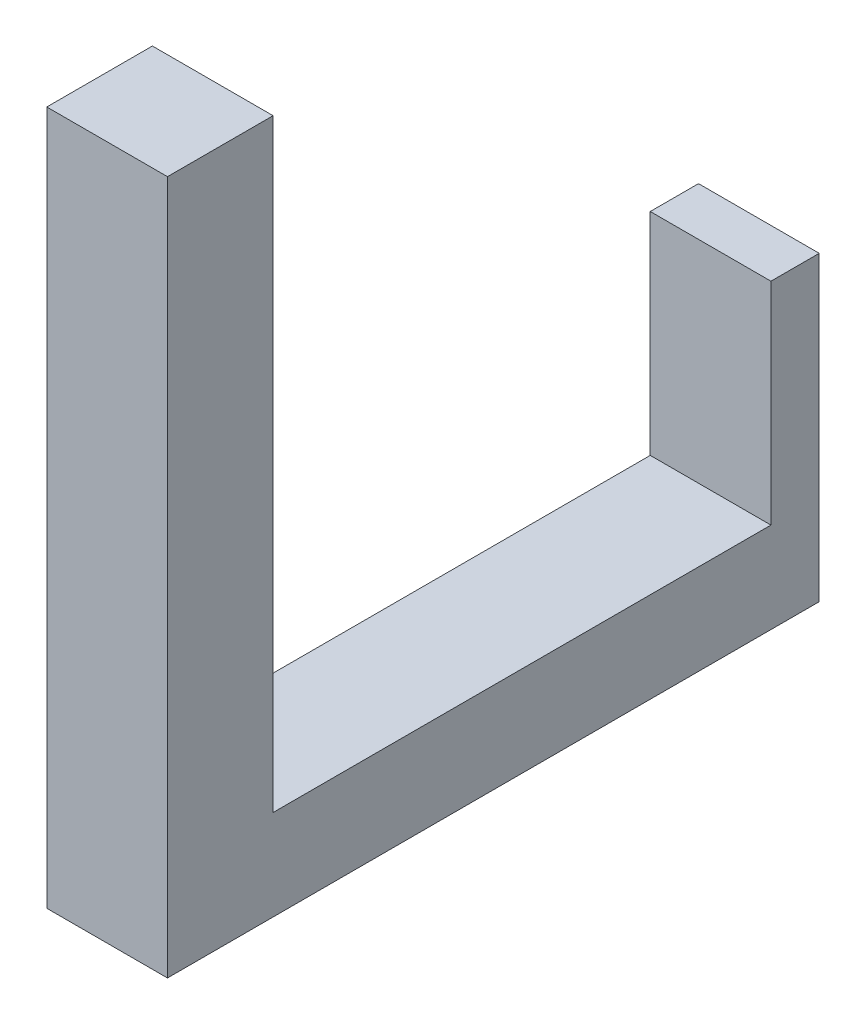
ISO-10303-21;
HEADER;
FILE_DESCRIPTION(('STEP AP214'),'2;1');
FILE_NAME('part.step','',(''),(''),'','','');
FILE_SCHEMA(('AUTOMOTIVE_DESIGN { 1 0 10303 214 1 1 1 1 }'));
ENDSEC;
DATA;
#1=APPLICATION_CONTEXT('core data for automotive mechanical design processes');
#2=APPLICATION_PROTOCOL_DEFINITION('international standard','automotive_design',2000,#1);
#3=PRODUCT_CONTEXT('',#1,'mechanical');
#4=PRODUCT('Part','Part','',(#3));
#5=PRODUCT_RELATED_PRODUCT_CATEGORY('part','',(#4));
#6=PRODUCT_DEFINITION_FORMATION('','',#4);
#7=PRODUCT_DEFINITION_CONTEXT('part definition',#1,'design');
#8=PRODUCT_DEFINITION('design','',#6,#7);
#9=PRODUCT_DEFINITION_SHAPE('','',#8);
#10=(LENGTH_UNIT() NAMED_UNIT(*) SI_UNIT(.MILLI.,.METRE.));
#11=(NAMED_UNIT(*) PLANE_ANGLE_UNIT() SI_UNIT($,.RADIAN.));
#12=(NAMED_UNIT(*) SI_UNIT($,.STERADIAN.) SOLID_ANGLE_UNIT());
#13=UNCERTAINTY_MEASURE_WITH_UNIT(LENGTH_MEASURE(1.E-05),#10,'distance_accuracy_value','');
#14=(GEOMETRIC_REPRESENTATION_CONTEXT(3) GLOBAL_UNCERTAINTY_ASSIGNED_CONTEXT((#13)) GLOBAL_UNIT_ASSIGNED_CONTEXT((#10,
#11,#12)) REPRESENTATION_CONTEXT('',''));
#15=CARTESIAN_POINT('',(0.,0.,0.));
#16=DIRECTION('',(0.,0.,1.));
#17=DIRECTION('',(1.,0.,0.));
#18=AXIS2_PLACEMENT_3D('',#15,#16,#17);
#19=CARTESIAN_POINT('',(-20.,30.,208.));
#20=DIRECTION('',(0.,1.,0.));
#21=DIRECTION('',(0.,0.,1.));
#22=AXIS2_PLACEMENT_3D('',#19,#20,#21);
#23=PLANE('',#22);
#24=DIRECTION('',(0.,0.,-1.));
#25=VECTOR('',#24,1.);
#26=CARTESIAN_POINT('',(-20.,30.,208.));
#27=LINE('',#26,#25);
#28=CARTESIAN_POINT('',(-20.,30.,173.));
#29=VERTEX_POINT('',#28);
#30=CARTESIAN_POINT('',(-20.,30.,8.));
#31=VERTEX_POINT('',#30);
#32=EDGE_CURVE('E60',#29,#31,#27,.T.);
#33=ORIENTED_EDGE('',*,*,#32,.F.);
#34=DIRECTION('',(-1.,0.,0.));
#35=VECTOR('',#34,1.);
#36=CARTESIAN_POINT('',(-20.,30.,173.));
#37=LINE('',#36,#35);
#38=CARTESIAN_POINT('',(20.,30.,173.));
#39=VERTEX_POINT('',#38);
#40=EDGE_CURVE('E55',#39,#29,#37,.T.);
#41=ORIENTED_EDGE('',*,*,#40,.F.);
#42=DIRECTION('',(0.,0.,-1.));
#43=VECTOR('',#42,1.);
#44=CARTESIAN_POINT('',(20.,30.,208.));
#45=LINE('',#44,#43);
#46=CARTESIAN_POINT('',(20.,30.,8.));
#47=VERTEX_POINT('',#46);
#48=EDGE_CURVE('E158',#39,#47,#45,.T.);
#49=ORIENTED_EDGE('',*,*,#48,.T.);
#50=DIRECTION('',(1.,0.,0.));
#51=VECTOR('',#50,1.);
#52=CARTESIAN_POINT('',(-20.,30.,8.));
#53=LINE('',#52,#51);
#54=EDGE_CURVE('E147',#31,#47,#53,.T.);
#55=ORIENTED_EDGE('',*,*,#54,.F.);
#56=EDGE_LOOP('',(#33,#41,#49,#55));
#57=FACE_BOUND('',#56,.T.);
#58=ADVANCED_FACE('F39',(#57),#23,.T.);
#59=CARTESIAN_POINT('',(20.,100.,-8.));
#60=DIRECTION('',(-1.,0.,0.));
#61=DIRECTION('',(0.,0.,1.));
#62=AXIS2_PLACEMENT_3D('',#59,#60,#61);
#63=PLANE('',#62);
#64=DIRECTION('',(0.,0.,-1.));
#65=VECTOR('',#64,1.);
#66=CARTESIAN_POINT('',(20.,0.,-8.));
#67=LINE('',#66,#65);
#68=CARTESIAN_POINT('',(20.,0.,208.));
#69=VERTEX_POINT('',#68);
#70=CARTESIAN_POINT('',(20.,0.,-8.));
#71=VERTEX_POINT('',#70);
#72=EDGE_CURVE('E161',#69,#71,#67,.T.);
#73=ORIENTED_EDGE('',*,*,#72,.T.);
#74=DIRECTION('',(0.,-1.,0.));
#75=VECTOR('',#74,1.);
#76=CARTESIAN_POINT('',(20.,100.,-8.));
#77=LINE('',#76,#75);
#78=CARTESIAN_POINT('',(20.,100.,-8.));
#79=VERTEX_POINT('',#78);
#80=EDGE_CURVE('E11',#79,#71,#77,.T.);
#81=ORIENTED_EDGE('',*,*,#80,.F.);
#82=DIRECTION('',(0.,0.,-1.));
#83=VECTOR('',#82,1.);
#84=CARTESIAN_POINT('',(20.,100.,-8.));
#85=LINE('',#84,#83);
#86=CARTESIAN_POINT('',(20.,100.,8.));
#87=VERTEX_POINT('',#86);
#88=EDGE_CURVE('E162',#87,#79,#85,.T.);
#89=ORIENTED_EDGE('',*,*,#88,.F.);
#90=DIRECTION('',(0.,-1.,0.));
#91=VECTOR('',#90,1.);
#92=CARTESIAN_POINT('',(20.,100.,8.));
#93=LINE('',#92,#91);
#94=EDGE_CURVE('E175',#87,#47,#93,.T.);
#95=ORIENTED_EDGE('',*,*,#94,.T.);
#96=ORIENTED_EDGE('',*,*,#48,.F.);
#97=DIRECTION('',(0.,-1.,0.));
#98=VECTOR('',#97,1.);
#99=CARTESIAN_POINT('',(20.,230.,173.));
#100=LINE('',#99,#98);
#101=CARTESIAN_POINT('',(20.,230.,173.));
#102=VERTEX_POINT('',#101);
#103=EDGE_CURVE('E143',#102,#39,#100,.T.);
#104=ORIENTED_EDGE('',*,*,#103,.F.);
#105=DIRECTION('',(0.,0.,-1.));
#106=VECTOR('',#105,1.);
#107=CARTESIAN_POINT('',(20.,230.,173.));
#108=LINE('',#107,#106);
#109=CARTESIAN_POINT('',(20.,230.,208.));
#110=VERTEX_POINT('',#109);
#111=EDGE_CURVE('E125',#110,#102,#108,.T.);
#112=ORIENTED_EDGE('',*,*,#111,.F.);
#113=DIRECTION('',(0.,-1.,0.));
#114=VECTOR('',#113,1.);
#115=CARTESIAN_POINT('',(20.,30.,208.));
#116=LINE('',#115,#114);
#117=EDGE_CURVE('E116',#110,#69,#116,.T.);
#118=ORIENTED_EDGE('',*,*,#117,.T.);
#119=EDGE_LOOP('',(#73,#81,#89,#95,#96,#104,#112,#118));
#120=FACE_BOUND('',#119,.T.);
#121=ADVANCED_FACE('F41',(#120),#63,.F.);
#122=CARTESIAN_POINT('',(-20.,100.,-8.));
#123=DIRECTION('',(0.,0.,1.));
#124=DIRECTION('',(1.,0.,0.));
#125=AXIS2_PLACEMENT_3D('',#122,#123,#124);
#126=PLANE('',#125);
#127=DIRECTION('',(-1.,0.,0.));
#128=VECTOR('',#127,1.);
#129=CARTESIAN_POINT('',(-20.,0.,-8.));
#130=LINE('',#129,#128);
#131=CARTESIAN_POINT('',(-20.,0.,-8.));
#132=VERTEX_POINT('',#131);
#133=EDGE_CURVE('E179',#71,#132,#130,.T.);
#134=ORIENTED_EDGE('',*,*,#133,.T.);
#135=DIRECTION('',(0.,-1.,0.));
#136=VECTOR('',#135,1.);
#137=CARTESIAN_POINT('',(-20.,100.,-8.));
#138=LINE('',#137,#136);
#139=CARTESIAN_POINT('',(-20.,100.,-8.));
#140=VERTEX_POINT('',#139);
#141=EDGE_CURVE('E48',#140,#132,#138,.T.);
#142=ORIENTED_EDGE('',*,*,#141,.F.);
#143=DIRECTION('',(-1.,0.,0.));
#144=VECTOR('',#143,1.);
#145=CARTESIAN_POINT('',(-20.,100.,-8.));
#146=LINE('',#145,#144);
#147=EDGE_CURVE('E166',#79,#140,#146,.T.);
#148=ORIENTED_EDGE('',*,*,#147,.F.);
#149=ORIENTED_EDGE('',*,*,#80,.T.);
#150=EDGE_LOOP('',(#134,#142,#148,#149));
#151=FACE_BOUND('',#150,.T.);
#152=ADVANCED_FACE('F209',(#151),#126,.F.);
#153=CARTESIAN_POINT('',(-20.,100.,-8.));
#154=DIRECTION('',(1.,0.,0.));
#155=DIRECTION('',(0.,0.,-1.));
#156=AXIS2_PLACEMENT_3D('',#153,#154,#155);
#157=PLANE('',#156);
#158=DIRECTION('',(0.,0.,1.));
#159=VECTOR('',#158,1.);
#160=CARTESIAN_POINT('',(-20.,0.,-8.));
#161=LINE('',#160,#159);
#162=CARTESIAN_POINT('',(-20.,0.,208.));
#163=VERTEX_POINT('',#162);
#164=EDGE_CURVE('E111',#132,#163,#161,.T.);
#165=ORIENTED_EDGE('',*,*,#164,.T.);
#166=DIRECTION('',(0.,-1.,0.));
#167=VECTOR('',#166,1.);
#168=CARTESIAN_POINT('',(-20.,30.,208.));
#169=LINE('',#168,#167);
#170=CARTESIAN_POINT('',(-20.,230.,208.));
#171=VERTEX_POINT('',#170);
#172=EDGE_CURVE('E103',#171,#163,#169,.T.);
#173=ORIENTED_EDGE('',*,*,#172,.F.);
#174=DIRECTION('',(0.,0.,1.));
#175=VECTOR('',#174,1.);
#176=CARTESIAN_POINT('',(-20.,230.,173.));
#177=LINE('',#176,#175);
#178=CARTESIAN_POINT('',(-20.,230.,173.));
#179=VERTEX_POINT('',#178);
#180=EDGE_CURVE('E108',#179,#171,#177,.T.);
#181=ORIENTED_EDGE('',*,*,#180,.F.);
#182=DIRECTION('',(0.,-1.,0.));
#183=VECTOR('',#182,1.);
#184=CARTESIAN_POINT('',(-20.,230.,173.));
#185=LINE('',#184,#183);
#186=EDGE_CURVE('E139',#179,#29,#185,.T.);
#187=ORIENTED_EDGE('',*,*,#186,.T.);
#188=ORIENTED_EDGE('',*,*,#32,.T.);
#189=DIRECTION('',(0.,-1.,0.));
#190=VECTOR('',#189,1.);
#191=CARTESIAN_POINT('',(-20.,100.,8.));
#192=LINE('',#191,#190);
#193=CARTESIAN_POINT('',(-20.,100.,8.));
#194=VERTEX_POINT('',#193);
#195=EDGE_CURVE('E187',#194,#31,#192,.T.);
#196=ORIENTED_EDGE('',*,*,#195,.F.);
#197=DIRECTION('',(0.,0.,1.));
#198=VECTOR('',#197,1.);
#199=CARTESIAN_POINT('',(-20.,100.,-8.));
#200=LINE('',#199,#198);
#201=EDGE_CURVE('E169',#140,#194,#200,.T.);
#202=ORIENTED_EDGE('',*,*,#201,.F.);
#203=ORIENTED_EDGE('',*,*,#141,.T.);
#204=EDGE_LOOP('',(#165,#173,#181,#187,#188,#196,#202,#203));
#205=FACE_BOUND('',#204,.T.);
#206=ADVANCED_FACE('F105',(#205),#157,.F.);
#207=CARTESIAN_POINT('',(-20.,100.,8.));
#208=DIRECTION('',(0.,0.,-1.));
#209=DIRECTION('',(-1.,0.,0.));
#210=AXIS2_PLACEMENT_3D('',#207,#208,#209);
#211=PLANE('',#210);
#212=ORIENTED_EDGE('',*,*,#195,.T.);
#213=ORIENTED_EDGE('',*,*,#54,.T.);
#214=ORIENTED_EDGE('',*,*,#94,.F.);
#215=DIRECTION('',(1.,0.,0.));
#216=VECTOR('',#215,1.);
#217=CARTESIAN_POINT('',(-20.,100.,8.));
#218=LINE('',#217,#216);
#219=EDGE_CURVE('E172',#194,#87,#218,.T.);
#220=ORIENTED_EDGE('',*,*,#219,.F.);
#221=EDGE_LOOP('',(#212,#213,#214,#220));
#222=FACE_BOUND('',#221,.T.);
#223=ADVANCED_FACE('F205',(#222),#211,.F.);
#224=CARTESIAN_POINT('',(0.,100.,0.));
#225=DIRECTION('',(0.,1.,0.));
#226=DIRECTION('',(0.,0.,1.));
#227=AXIS2_PLACEMENT_3D('',#224,#225,#226);
#228=PLANE('',#227);
#229=ORIENTED_EDGE('',*,*,#88,.T.);
#230=ORIENTED_EDGE('',*,*,#147,.T.);
#231=ORIENTED_EDGE('',*,*,#201,.T.);
#232=ORIENTED_EDGE('',*,*,#219,.T.);
#233=EDGE_LOOP('',(#229,#230,#231,#232));
#234=FACE_BOUND('',#233,.T.);
#235=ADVANCED_FACE('F208',(#234),#228,.T.);
#236=CARTESIAN_POINT('',(0.,0.,0.));
#237=DIRECTION('',(0.,1.,0.));
#238=DIRECTION('',(0.,0.,1.));
#239=AXIS2_PLACEMENT_3D('',#236,#237,#238);
#240=PLANE('',#239);
#241=ORIENTED_EDGE('',*,*,#72,.F.);
#242=DIRECTION('',(1.,0.,0.));
#243=VECTOR('',#242,1.);
#244=CARTESIAN_POINT('',(-20.,0.,208.));
#245=LINE('',#244,#243);
#246=EDGE_CURVE('E148',#163,#69,#245,.T.);
#247=ORIENTED_EDGE('',*,*,#246,.F.);
#248=ORIENTED_EDGE('',*,*,#164,.F.);
#249=ORIENTED_EDGE('',*,*,#133,.F.);
#250=EDGE_LOOP('',(#241,#247,#248,#249));
#251=FACE_BOUND('',#250,.T.);
#252=ADVANCED_FACE('F196',(#251),#240,.F.);
#253=CARTESIAN_POINT('',(0.,0.,208.));
#254=DIRECTION('',(0.,0.,-1.));
#255=DIRECTION('',(-1.,0.,0.));
#256=AXIS2_PLACEMENT_3D('',#253,#254,#255);
#257=PLANE('',#256);
#258=ORIENTED_EDGE('',*,*,#246,.T.);
#259=ORIENTED_EDGE('',*,*,#117,.F.);
#260=DIRECTION('',(1.,0.,0.));
#261=VECTOR('',#260,1.);
#262=CARTESIAN_POINT('',(-20.,230.,208.));
#263=LINE('',#262,#261);
#264=EDGE_CURVE('E119',#171,#110,#263,.T.);
#265=ORIENTED_EDGE('',*,*,#264,.F.);
#266=ORIENTED_EDGE('',*,*,#172,.T.);
#267=EDGE_LOOP('',(#258,#259,#265,#266));
#268=FACE_BOUND('',#267,.T.);
#269=ADVANCED_FACE('F120',(#268),#257,.F.);
#270=CARTESIAN_POINT('',(-20.,230.,173.));
#271=DIRECTION('',(0.,0.,1.));
#272=DIRECTION('',(1.,0.,0.));
#273=AXIS2_PLACEMENT_3D('',#270,#271,#272);
#274=PLANE('',#273);
#275=ORIENTED_EDGE('',*,*,#40,.T.);
#276=ORIENTED_EDGE('',*,*,#186,.F.);
#277=DIRECTION('',(-1.,0.,0.));
#278=VECTOR('',#277,1.);
#279=CARTESIAN_POINT('',(-20.,230.,173.));
#280=LINE('',#279,#278);
#281=EDGE_CURVE('E129',#102,#179,#280,.T.);
#282=ORIENTED_EDGE('',*,*,#281,.F.);
#283=ORIENTED_EDGE('',*,*,#103,.T.);
#284=EDGE_LOOP('',(#275,#276,#282,#283));
#285=FACE_BOUND('',#284,.T.);
#286=ADVANCED_FACE('F201',(#285),#274,.F.);
#287=CARTESIAN_POINT('',(0.,230.,0.));
#288=DIRECTION('',(0.,1.,0.));
#289=DIRECTION('',(0.,0.,1.));
#290=AXIS2_PLACEMENT_3D('',#287,#288,#289);
#291=PLANE('',#290);
#292=ORIENTED_EDGE('',*,*,#180,.T.);
#293=ORIENTED_EDGE('',*,*,#264,.T.);
#294=ORIENTED_EDGE('',*,*,#111,.T.);
#295=ORIENTED_EDGE('',*,*,#281,.T.);
#296=EDGE_LOOP('',(#292,#293,#294,#295));
#297=FACE_BOUND('',#296,.T.);
#298=ADVANCED_FACE('F127',(#297),#291,.T.);
#299=CLOSED_SHELL('',(#58,#121,#152,#206,#223,#235,#252,#269,#286,#298));
#300=MANIFOLD_SOLID_BREP('B2',#299);
#301=ADVANCED_BREP_SHAPE_REPRESENTATION('',(#18,#300),#14);
#302=SHAPE_DEFINITION_REPRESENTATION(#9,#301);
ENDSEC;
END-ISO-10303-21;
